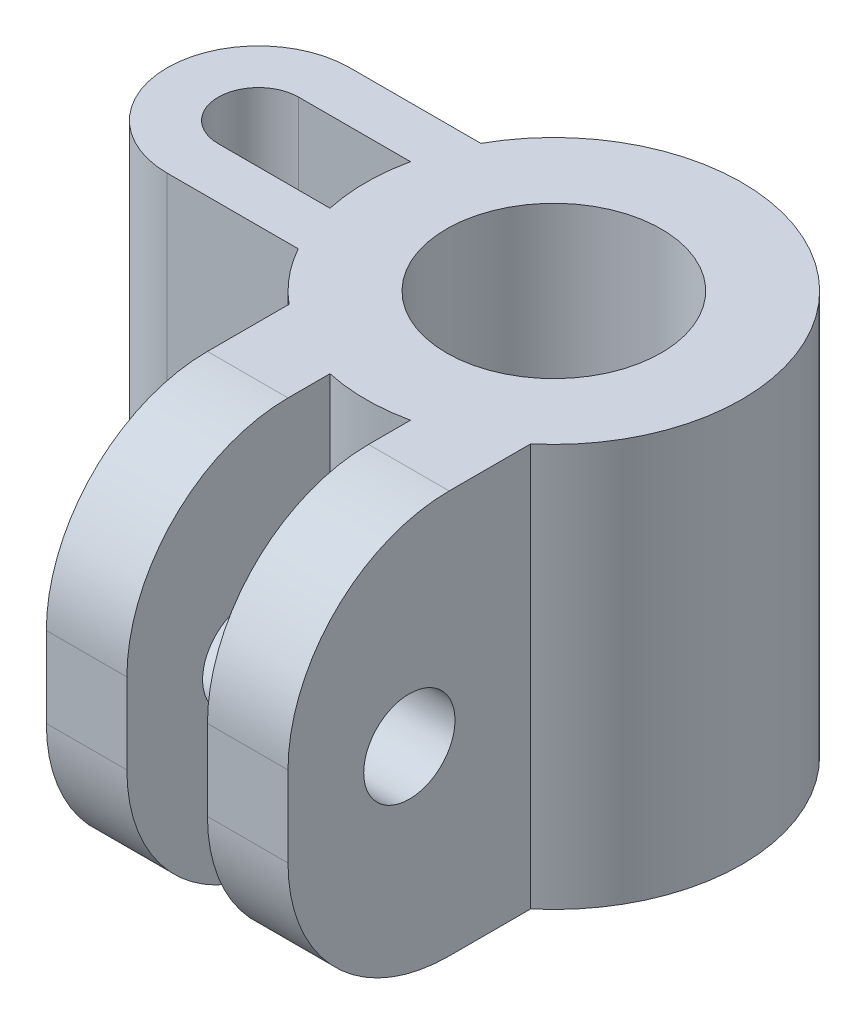
ISO-10303-21;
HEADER;
FILE_DESCRIPTION(('STEP AP214'),'2;1');
FILE_NAME('part.step','',(''),(''),'','','');
FILE_SCHEMA(('AUTOMOTIVE_DESIGN { 1 0 10303 214 1 1 1 1 }'));
ENDSEC;
DATA;
#1=APPLICATION_CONTEXT('core data for automotive mechanical design processes');
#2=APPLICATION_PROTOCOL_DEFINITION('international standard','automotive_design',2000,#1);
#3=PRODUCT_CONTEXT('',#1,'mechanical');
#4=PRODUCT('Part','Part','',(#3));
#5=PRODUCT_RELATED_PRODUCT_CATEGORY('part','',(#4));
#6=PRODUCT_DEFINITION_FORMATION('','',#4);
#7=PRODUCT_DEFINITION_CONTEXT('part definition',#1,'design');
#8=PRODUCT_DEFINITION('design','',#6,#7);
#9=PRODUCT_DEFINITION_SHAPE('','',#8);
#10=(LENGTH_UNIT() NAMED_UNIT(*) SI_UNIT(.MILLI.,.METRE.));
#11=(NAMED_UNIT(*) PLANE_ANGLE_UNIT() SI_UNIT($,.RADIAN.));
#12=(NAMED_UNIT(*) SI_UNIT($,.STERADIAN.) SOLID_ANGLE_UNIT());
#13=UNCERTAINTY_MEASURE_WITH_UNIT(LENGTH_MEASURE(1.E-05),#10,'distance_accuracy_value','');
#14=(GEOMETRIC_REPRESENTATION_CONTEXT(3) GLOBAL_UNCERTAINTY_ASSIGNED_CONTEXT((#13)) GLOBAL_UNIT_ASSIGNED_CONTEXT((#10,
#11,#12)) REPRESENTATION_CONTEXT('',''));
#15=CARTESIAN_POINT('',(0.,0.,0.));
#16=DIRECTION('',(0.,0.,1.));
#17=DIRECTION('',(1.,0.,0.));
#18=AXIS2_PLACEMENT_3D('',#15,#16,#17);
#19=CARTESIAN_POINT('',(0.,75.,0.));
#20=DIRECTION('',(0.,-1.,0.));
#21=DIRECTION('',(0.,0.,-1.));
#22=AXIS2_PLACEMENT_3D('',#19,#20,#21);
#23=CYLINDRICAL_SURFACE('',#22,35.);
#24=CARTESIAN_POINT('',(0.,0.,0.));
#25=DIRECTION('',(0.,1.,0.));
#26=DIRECTION('',(0.,0.,1.));
#27=AXIS2_PLACEMENT_3D('',#24,#25,#26);
#28=CIRCLE('',#27,35.);
#29=CARTESIAN_POINT('',(-7.5,0.,34.1869858279434));
#30=VERTEX_POINT('',#29);
#31=CARTESIAN_POINT('',(7.5,0.,34.1869858279434));
#32=VERTEX_POINT('',#31);
#33=EDGE_CURVE('E284',#30,#32,#28,.T.);
#34=ORIENTED_EDGE('',*,*,#33,.T.);
#35=DIRECTION('',(0.,-1.,0.));
#36=VECTOR('',#35,1.);
#37=CARTESIAN_POINT('',(7.5,75.,34.1869858279434));
#38=LINE('',#37,#36);
#39=CARTESIAN_POINT('',(7.5,75.,34.1869858279434));
#40=VERTEX_POINT('',#39);
#41=EDGE_CURVE('E221',#40,#32,#38,.T.);
#42=ORIENTED_EDGE('',*,*,#41,.F.);
#43=CARTESIAN_POINT('',(0.,75.,0.));
#44=DIRECTION('',(0.,1.,0.));
#45=DIRECTION('',(0.,0.,1.));
#46=AXIS2_PLACEMENT_3D('',#43,#44,#45);
#47=CIRCLE('',#46,35.);
#48=CARTESIAN_POINT('',(-7.5,75.,34.1869858279434));
#49=VERTEX_POINT('',#48);
#50=EDGE_CURVE('E192',#49,#40,#47,.T.);
#51=ORIENTED_EDGE('',*,*,#50,.F.);
#52=DIRECTION('',(0.,-1.,0.));
#53=VECTOR('',#52,1.);
#54=CARTESIAN_POINT('',(-7.5,75.,34.1869858279434));
#55=LINE('',#54,#53);
#56=EDGE_CURVE('E205',#49,#30,#55,.T.);
#57=ORIENTED_EDGE('',*,*,#56,.T.);
#58=EDGE_LOOP('',(#34,#42,#51,#57));
#59=FACE_BOUND('',#58,.T.);
#60=ADVANCED_FACE('F39',(#59),#23,.T.);
#61=CARTESIAN_POINT('',(7.5,75.,0.));
#62=DIRECTION('',(1.,0.,0.));
#63=DIRECTION('',(0.,0.,-1.));
#64=AXIS2_PLACEMENT_3D('',#61,#62,#63);
#65=PLANE('',#64);
#66=CARTESIAN_POINT('',(7.50000000000001,37.5,49.405));
#67=DIRECTION('',(1.,0.,0.));
#68=DIRECTION('',(0.,0.,-1.));
#69=AXIS2_PLACEMENT_3D('',#66,#67,#68);
#70=CIRCLE('',#69,8.5);
#71=CARTESIAN_POINT('',(7.50000000000001,37.5,40.905));
#72=VERTEX_POINT('',#71);
#73=EDGE_CURVE('E280',#72,#72,#70,.T.);
#74=ORIENTED_EDGE('',*,*,#73,.T.);
#75=EDGE_LOOP('',(#74));
#76=FACE_BOUND('',#75,.T.);
#77=DIRECTION('',(0.,0.,1.));
#78=VECTOR('',#77,1.);
#79=CARTESIAN_POINT('',(7.5,0.,0.));
#80=LINE('',#79,#78);
#81=CARTESIAN_POINT('',(7.50000000000001,0.,42.));
#82=VERTEX_POINT('',#81);
#83=EDGE_CURVE('E293',#32,#82,#80,.T.);
#84=ORIENTED_EDGE('',*,*,#83,.T.);
#85=CARTESIAN_POINT('',(7.50000000000001,30.,42.));
#86=DIRECTION('',(1.,0.,0.));
#87=DIRECTION('',(0.,0.,-1.));
#88=AXIS2_PLACEMENT_3D('',#85,#86,#87);
#89=CIRCLE('',#88,30.);
#90=CARTESIAN_POINT('',(7.50000000000001,30.,72.));
#91=VERTEX_POINT('',#90);
#92=EDGE_CURVE('E246',#82,#91,#89,.F.);
#93=ORIENTED_EDGE('',*,*,#92,.T.);
#94=DIRECTION('',(0.,-1.,0.));
#95=VECTOR('',#94,1.);
#96=CARTESIAN_POINT('',(7.50000000000001,75.,72.));
#97=LINE('',#96,#95);
#98=CARTESIAN_POINT('',(7.50000000000001,45.,72.));
#99=VERTEX_POINT('',#98);
#100=EDGE_CURVE('E332',#99,#91,#97,.T.);
#101=ORIENTED_EDGE('',*,*,#100,.F.);
#102=CARTESIAN_POINT('',(7.50000000000001,45.,42.));
#103=DIRECTION('',(1.,0.,0.));
#104=DIRECTION('',(0.,0.,-1.));
#105=AXIS2_PLACEMENT_3D('',#102,#103,#104);
#106=CIRCLE('',#105,30.);
#107=CARTESIAN_POINT('',(7.50000000000001,75.,42.));
#108=VERTEX_POINT('',#107);
#109=EDGE_CURVE('E54',#99,#108,#106,.F.);
#110=ORIENTED_EDGE('',*,*,#109,.T.);
#111=DIRECTION('',(0.,0.,1.));
#112=VECTOR('',#111,1.);
#113=CARTESIAN_POINT('',(7.5,75.,0.));
#114=LINE('',#113,#112);
#115=EDGE_CURVE('E253',#40,#108,#114,.T.);
#116=ORIENTED_EDGE('',*,*,#115,.F.);
#117=ORIENTED_EDGE('',*,*,#41,.T.);
#118=EDGE_LOOP('',(#84,#93,#101,#110,#116,#117));
#119=FACE_BOUND('',#118,.T.);
#120=ADVANCED_FACE('F413',(#76,#119),#65,.F.);
#121=CARTESIAN_POINT('',(1.33226762955019E-13,75.,72.));
#122=DIRECTION('',(0.,0.,-1.));
#123=DIRECTION('',(-1.,0.,0.));
#124=AXIS2_PLACEMENT_3D('',#121,#122,#123);
#125=PLANE('',#124);
#126=ORIENTED_EDGE('',*,*,#100,.T.);
#127=DIRECTION('',(1.,0.,0.));
#128=VECTOR('',#127,1.);
#129=CARTESIAN_POINT('',(1.33226762955019E-13,30.,72.));
#130=LINE('',#129,#128);
#131=CARTESIAN_POINT('',(22.5,30.,72.));
#132=VERTEX_POINT('',#131);
#133=EDGE_CURVE('E239',#91,#132,#130,.T.);
#134=ORIENTED_EDGE('',*,*,#133,.T.);
#135=DIRECTION('',(0.,-1.,0.));
#136=VECTOR('',#135,1.);
#137=CARTESIAN_POINT('',(22.5,75.,72.));
#138=LINE('',#137,#136);
#139=CARTESIAN_POINT('',(22.5,45.,72.));
#140=VERTEX_POINT('',#139);
#141=EDGE_CURVE('E330',#140,#132,#138,.T.);
#142=ORIENTED_EDGE('',*,*,#141,.F.);
#143=DIRECTION('',(1.,0.,0.));
#144=VECTOR('',#143,1.);
#145=CARTESIAN_POINT('',(7.50000000000001,45.,72.));
#146=LINE('',#145,#144);
#147=EDGE_CURVE('E237',#140,#99,#146,.F.);
#148=ORIENTED_EDGE('',*,*,#147,.T.);
#149=EDGE_LOOP('',(#126,#134,#142,#148));
#150=FACE_BOUND('',#149,.T.);
#151=ADVANCED_FACE('F419',(#150),#125,.F.);
#152=CARTESIAN_POINT('',(22.5,75.,0.));
#153=DIRECTION('',(-1.,0.,0.));
#154=DIRECTION('',(0.,0.,1.));
#155=AXIS2_PLACEMENT_3D('',#152,#153,#154);
#156=PLANE('',#155);
#157=CARTESIAN_POINT('',(22.5,37.5,49.405));
#158=DIRECTION('',(-1.,0.,0.));
#159=DIRECTION('',(0.,0.,1.));
#160=AXIS2_PLACEMENT_3D('',#157,#158,#159);
#161=CIRCLE('',#160,8.5);
#162=CARTESIAN_POINT('',(22.5,37.5,57.905));
#163=VERTEX_POINT('',#162);
#164=EDGE_CURVE('E216',#163,#163,#161,.T.);
#165=ORIENTED_EDGE('',*,*,#164,.T.);
#166=EDGE_LOOP('',(#165));
#167=FACE_BOUND('',#166,.T.);
#168=ORIENTED_EDGE('',*,*,#141,.T.);
#169=CARTESIAN_POINT('',(22.5,30.,42.));
#170=DIRECTION('',(-1.,0.,0.));
#171=DIRECTION('',(0.,0.,1.));
#172=AXIS2_PLACEMENT_3D('',#169,#170,#171);
#173=CIRCLE('',#172,30.);
#174=CARTESIAN_POINT('',(22.5,0.,42.));
#175=VERTEX_POINT('',#174);
#176=EDGE_CURVE('E243',#132,#175,#173,.F.);
#177=ORIENTED_EDGE('',*,*,#176,.T.);
#178=DIRECTION('',(0.,0.,-1.));
#179=VECTOR('',#178,1.);
#180=CARTESIAN_POINT('',(22.5,0.,0.));
#181=LINE('',#180,#179);
#182=CARTESIAN_POINT('',(22.5,0.,26.809513236909));
#183=VERTEX_POINT('',#182);
#184=EDGE_CURVE('E296',#175,#183,#181,.T.);
#185=ORIENTED_EDGE('',*,*,#184,.T.);
#186=DIRECTION('',(0.,-1.,0.));
#187=VECTOR('',#186,1.);
#188=CARTESIAN_POINT('',(22.5,75.,26.809513236909));
#189=LINE('',#188,#187);
#190=CARTESIAN_POINT('',(22.5,75.,26.809513236909));
#191=VERTEX_POINT('',#190);
#192=EDGE_CURVE('E259',#191,#183,#189,.T.);
#193=ORIENTED_EDGE('',*,*,#192,.F.);
#194=DIRECTION('',(0.,0.,-1.));
#195=VECTOR('',#194,1.);
#196=CARTESIAN_POINT('',(22.5,75.,0.));
#197=LINE('',#196,#195);
#198=CARTESIAN_POINT('',(22.5,75.,42.));
#199=VERTEX_POINT('',#198);
#200=EDGE_CURVE('E250',#199,#191,#197,.T.);
#201=ORIENTED_EDGE('',*,*,#200,.F.);
#202=CARTESIAN_POINT('',(22.5,45.,42.));
#203=DIRECTION('',(-1.,0.,0.));
#204=DIRECTION('',(0.,0.,1.));
#205=AXIS2_PLACEMENT_3D('',#202,#203,#204);
#206=CIRCLE('',#205,30.);
#207=EDGE_CURVE('E62',#199,#140,#206,.F.);
#208=ORIENTED_EDGE('',*,*,#207,.T.);
#209=EDGE_LOOP('',(#168,#177,#185,#193,#201,#208));
#210=FACE_BOUND('',#209,.T.);
#211=ADVANCED_FACE('F256',(#167,#210),#156,.F.);
#212=CARTESIAN_POINT('',(-30.5941170815567,0.,-17.));
#213=VERTEX_POINT('',#212);
#214=EDGE_CURVE('E298',#183,#213,#28,.T.);
#215=ORIENTED_EDGE('',*,*,#214,.T.);
#216=DIRECTION('',(0.,-1.,0.));
#217=VECTOR('',#216,1.);
#218=CARTESIAN_POINT('',(-30.5941170815567,75.,-17.));
#219=LINE('',#218,#217);
#220=CARTESIAN_POINT('',(-30.5941170815567,75.,-17.));
#221=VERTEX_POINT('',#220);
#222=EDGE_CURVE('E326',#221,#213,#219,.T.);
#223=ORIENTED_EDGE('',*,*,#222,.F.);
#224=EDGE_CURVE('E261',#191,#221,#47,.T.);
#225=ORIENTED_EDGE('',*,*,#224,.F.);
#226=ORIENTED_EDGE('',*,*,#192,.T.);
#227=EDGE_LOOP('',(#215,#223,#225,#226));
#228=FACE_BOUND('',#227,.T.);
#229=ADVANCED_FACE('F415',(#228),#23,.T.);
#230=CARTESIAN_POINT('',(0.,75.,-17.));
#231=DIRECTION('',(0.,0.,1.));
#232=DIRECTION('',(1.,0.,0.));
#233=AXIS2_PLACEMENT_3D('',#230,#231,#232);
#234=PLANE('',#233);
#235=DIRECTION('',(-1.,0.,0.));
#236=VECTOR('',#235,1.);
#237=CARTESIAN_POINT('',(0.,0.,-17.));
#238=LINE('',#237,#236);
#239=CARTESIAN_POINT('',(-55.,0.,-17.));
#240=VERTEX_POINT('',#239);
#241=EDGE_CURVE('E299',#213,#240,#238,.T.);
#242=ORIENTED_EDGE('',*,*,#241,.T.);
#243=DIRECTION('',(0.,-1.,0.));
#244=VECTOR('',#243,1.);
#245=CARTESIAN_POINT('',(-55.,75.,-17.));
#246=LINE('',#245,#244);
#247=CARTESIAN_POINT('',(-55.,75.,-17.));
#248=VERTEX_POINT('',#247);
#249=EDGE_CURVE('E323',#248,#240,#246,.T.);
#250=ORIENTED_EDGE('',*,*,#249,.F.);
#251=DIRECTION('',(-1.,0.,0.));
#252=VECTOR('',#251,1.);
#253=CARTESIAN_POINT('',(0.,75.,-17.));
#254=LINE('',#253,#252);
#255=EDGE_CURVE('E263',#221,#248,#254,.T.);
#256=ORIENTED_EDGE('',*,*,#255,.F.);
#257=ORIENTED_EDGE('',*,*,#222,.T.);
#258=EDGE_LOOP('',(#242,#250,#256,#257));
#259=FACE_BOUND('',#258,.T.);
#260=ADVANCED_FACE('F425',(#259),#234,.F.);
#261=CARTESIAN_POINT('',(-55.,75.,0.));
#262=DIRECTION('',(0.,-1.,0.));
#263=DIRECTION('',(0.,0.,-1.));
#264=AXIS2_PLACEMENT_3D('',#261,#262,#263);
#265=CYLINDRICAL_SURFACE('',#264,17.);
#266=CARTESIAN_POINT('',(-55.,0.,0.));
#267=DIRECTION('',(0.,1.,0.));
#268=DIRECTION('',(0.,0.,1.));
#269=AXIS2_PLACEMENT_3D('',#266,#267,#268);
#270=CIRCLE('',#269,17.);
#271=CARTESIAN_POINT('',(-55.,0.,17.));
#272=VERTEX_POINT('',#271);
#273=EDGE_CURVE('E301',#240,#272,#270,.T.);
#274=ORIENTED_EDGE('',*,*,#273,.T.);
#275=DIRECTION('',(0.,-1.,0.));
#276=VECTOR('',#275,1.);
#277=CARTESIAN_POINT('',(-55.,75.,17.));
#278=LINE('',#277,#276);
#279=CARTESIAN_POINT('',(-55.,75.,17.));
#280=VERTEX_POINT('',#279);
#281=EDGE_CURVE('E320',#280,#272,#278,.T.);
#282=ORIENTED_EDGE('',*,*,#281,.F.);
#283=CARTESIAN_POINT('',(-55.,75.,0.));
#284=DIRECTION('',(0.,1.,0.));
#285=DIRECTION('',(0.,0.,1.));
#286=AXIS2_PLACEMENT_3D('',#283,#284,#285);
#287=CIRCLE('',#286,17.);
#288=EDGE_CURVE('E268',#248,#280,#287,.T.);
#289=ORIENTED_EDGE('',*,*,#288,.F.);
#290=ORIENTED_EDGE('',*,*,#249,.T.);
#291=EDGE_LOOP('',(#274,#282,#289,#290));
#292=FACE_BOUND('',#291,.T.);
#293=ADVANCED_FACE('F440',(#292),#265,.T.);
#294=CARTESIAN_POINT('',(0.,75.,17.));
#295=DIRECTION('',(0.,0.,-1.));
#296=DIRECTION('',(-1.,0.,0.));
#297=AXIS2_PLACEMENT_3D('',#294,#295,#296);
#298=PLANE('',#297);
#299=DIRECTION('',(1.,0.,0.));
#300=VECTOR('',#299,1.);
#301=CARTESIAN_POINT('',(0.,0.,17.));
#302=LINE('',#301,#300);
#303=CARTESIAN_POINT('',(-30.5941170815567,0.,17.));
#304=VERTEX_POINT('',#303);
#305=EDGE_CURVE('E303',#272,#304,#302,.T.);
#306=ORIENTED_EDGE('',*,*,#305,.T.);
#307=DIRECTION('',(0.,-1.,0.));
#308=VECTOR('',#307,1.);
#309=CARTESIAN_POINT('',(-30.5941170815567,75.,17.));
#310=LINE('',#309,#308);
#311=CARTESIAN_POINT('',(-30.5941170815567,75.,17.));
#312=VERTEX_POINT('',#311);
#313=EDGE_CURVE('E317',#312,#304,#310,.T.);
#314=ORIENTED_EDGE('',*,*,#313,.F.);
#315=DIRECTION('',(1.,0.,0.));
#316=VECTOR('',#315,1.);
#317=CARTESIAN_POINT('',(0.,75.,17.));
#318=LINE('',#317,#316);
#319=EDGE_CURVE('E270',#280,#312,#318,.T.);
#320=ORIENTED_EDGE('',*,*,#319,.F.);
#321=ORIENTED_EDGE('',*,*,#281,.T.);
#322=EDGE_LOOP('',(#306,#314,#320,#321));
#323=FACE_BOUND('',#322,.T.);
#324=ADVANCED_FACE('F435',(#323),#298,.F.);
#325=CARTESIAN_POINT('',(-22.5,0.,26.809513236909));
#326=VERTEX_POINT('',#325);
#327=EDGE_CURVE('E283',#304,#326,#28,.T.);
#328=ORIENTED_EDGE('',*,*,#327,.T.);
#329=DIRECTION('',(0.,-1.,0.));
#330=VECTOR('',#329,1.);
#331=CARTESIAN_POINT('',(-22.5,75.,26.809513236909));
#332=LINE('',#331,#330);
#333=CARTESIAN_POINT('',(-22.5,75.,26.809513236909));
#334=VERTEX_POINT('',#333);
#335=EDGE_CURVE('E314',#334,#326,#332,.T.);
#336=ORIENTED_EDGE('',*,*,#335,.F.);
#337=EDGE_CURVE('E191',#312,#334,#47,.T.);
#338=ORIENTED_EDGE('',*,*,#337,.F.);
#339=ORIENTED_EDGE('',*,*,#313,.T.);
#340=EDGE_LOOP('',(#328,#336,#338,#339));
#341=FACE_BOUND('',#340,.T.);
#342=ADVANCED_FACE('F380',(#341),#23,.T.);
#343=CARTESIAN_POINT('',(-22.5,75.,0.));
#344=DIRECTION('',(-1.,0.,0.));
#345=DIRECTION('',(0.,0.,1.));
#346=AXIS2_PLACEMENT_3D('',#343,#344,#345);
#347=PLANE('',#346);
#348=CARTESIAN_POINT('',(-22.5,37.5,49.405));
#349=DIRECTION('',(-1.,0.,0.));
#350=DIRECTION('',(0.,0.,1.));
#351=AXIS2_PLACEMENT_3D('',#348,#349,#350);
#352=CIRCLE('',#351,8.5);
#353=CARTESIAN_POINT('',(-22.5,37.5,57.905));
#354=VERTEX_POINT('',#353);
#355=EDGE_CURVE('E217',#354,#354,#352,.F.);
#356=ORIENTED_EDGE('',*,*,#355,.T.);
#357=EDGE_LOOP('',(#356));
#358=FACE_BOUND('',#357,.T.);
#359=DIRECTION('',(0.,0.,-1.));
#360=VECTOR('',#359,1.);
#361=CARTESIAN_POINT('',(-22.5,0.,0.));
#362=LINE('',#361,#360);
#363=CARTESIAN_POINT('',(-22.5,0.,42.));
#364=VERTEX_POINT('',#363);
#365=EDGE_CURVE('E305',#364,#326,#362,.T.);
#366=ORIENTED_EDGE('',*,*,#365,.F.);
#367=CARTESIAN_POINT('',(-22.5,30.,42.));
#368=DIRECTION('',(-1.,0.,0.));
#369=DIRECTION('',(0.,0.,1.));
#370=AXIS2_PLACEMENT_3D('',#367,#368,#369);
#371=CIRCLE('',#370,30.);
#372=CARTESIAN_POINT('',(-22.5,30.,72.));
#373=VERTEX_POINT('',#372);
#374=EDGE_CURVE('E226',#364,#373,#371,.T.);
#375=ORIENTED_EDGE('',*,*,#374,.T.);
#376=DIRECTION('',(0.,-1.,0.));
#377=VECTOR('',#376,1.);
#378=CARTESIAN_POINT('',(-22.5,75.,72.));
#379=LINE('',#378,#377);
#380=CARTESIAN_POINT('',(-22.5,45.,72.));
#381=VERTEX_POINT('',#380);
#382=EDGE_CURVE('E311',#381,#373,#379,.T.);
#383=ORIENTED_EDGE('',*,*,#382,.F.);
#384=CARTESIAN_POINT('',(-22.5,45.,42.));
#385=DIRECTION('',(-1.,0.,0.));
#386=DIRECTION('',(0.,0.,1.));
#387=AXIS2_PLACEMENT_3D('',#384,#385,#386);
#388=CIRCLE('',#387,30.);
#389=CARTESIAN_POINT('',(-22.5,75.,42.));
#390=VERTEX_POINT('',#389);
#391=EDGE_CURVE('E224',#381,#390,#388,.T.);
#392=ORIENTED_EDGE('',*,*,#391,.T.);
#393=DIRECTION('',(0.,0.,-1.));
#394=VECTOR('',#393,1.);
#395=CARTESIAN_POINT('',(-22.5,75.,0.));
#396=LINE('',#395,#394);
#397=EDGE_CURVE('E272',#390,#334,#396,.T.);
#398=ORIENTED_EDGE('',*,*,#397,.T.);
#399=ORIENTED_EDGE('',*,*,#335,.T.);
#400=EDGE_LOOP('',(#366,#375,#383,#392,#398,#399));
#401=FACE_BOUND('',#400,.T.);
#402=ADVANCED_FACE('F363',(#358,#401),#347,.T.);
#403=CARTESIAN_POINT('',(-1.33226762955019E-13,75.,72.));
#404=DIRECTION('',(0.,0.,1.));
#405=DIRECTION('',(1.,0.,0.));
#406=AXIS2_PLACEMENT_3D('',#403,#404,#405);
#407=PLANE('',#406);
#408=ORIENTED_EDGE('',*,*,#382,.T.);
#409=DIRECTION('',(-1.,0.,0.));
#410=VECTOR('',#409,1.);
#411=CARTESIAN_POINT('',(-7.49999999999999,30.,72.));
#412=LINE('',#411,#410);
#413=CARTESIAN_POINT('',(-7.49999999999999,30.,72.));
#414=VERTEX_POINT('',#413);
#415=EDGE_CURVE('E231',#373,#414,#412,.F.);
#416=ORIENTED_EDGE('',*,*,#415,.T.);
#417=DIRECTION('',(0.,-1.,0.));
#418=VECTOR('',#417,1.);
#419=CARTESIAN_POINT('',(-7.49999999999999,75.,72.));
#420=LINE('',#419,#418);
#421=CARTESIAN_POINT('',(-7.49999999999999,45.,72.));
#422=VERTEX_POINT('',#421);
#423=EDGE_CURVE('E207',#422,#414,#420,.T.);
#424=ORIENTED_EDGE('',*,*,#423,.F.);
#425=DIRECTION('',(-1.,0.,0.));
#426=VECTOR('',#425,1.);
#427=CARTESIAN_POINT('',(-1.33226762955019E-13,45.,72.));
#428=LINE('',#427,#426);
#429=EDGE_CURVE('E228',#422,#381,#428,.T.);
#430=ORIENTED_EDGE('',*,*,#429,.T.);
#431=EDGE_LOOP('',(#408,#416,#424,#430));
#432=FACE_BOUND('',#431,.T.);
#433=ADVANCED_FACE('F365',(#432),#407,.T.);
#434=CARTESIAN_POINT('',(0.,75.,-7.5));
#435=DIRECTION('',(0.,0.,-1.));
#436=DIRECTION('',(-1.,0.,0.));
#437=AXIS2_PLACEMENT_3D('',#434,#435,#436);
#438=PLANE('',#437);
#439=DIRECTION('',(1.,0.,0.));
#440=VECTOR('',#439,1.);
#441=CARTESIAN_POINT('',(0.,0.,-7.5));
#442=LINE('',#441,#440);
#443=CARTESIAN_POINT('',(-55.,0.,-7.5));
#444=VERTEX_POINT('',#443);
#445=CARTESIAN_POINT('',(-34.1869858279434,0.,-7.5));
#446=VERTEX_POINT('',#445);
#447=EDGE_CURVE('E204',#444,#446,#442,.T.);
#448=ORIENTED_EDGE('',*,*,#447,.T.);
#449=DIRECTION('',(0.,-1.,0.));
#450=VECTOR('',#449,1.);
#451=CARTESIAN_POINT('',(-34.1869858279434,75.,-7.5));
#452=LINE('',#451,#450);
#453=CARTESIAN_POINT('',(-34.1869858279434,75.,-7.5));
#454=VERTEX_POINT('',#453);
#455=EDGE_CURVE('E182',#454,#446,#452,.T.);
#456=ORIENTED_EDGE('',*,*,#455,.F.);
#457=DIRECTION('',(1.,0.,0.));
#458=VECTOR('',#457,1.);
#459=CARTESIAN_POINT('',(0.,75.,-7.5));
#460=LINE('',#459,#458);
#461=CARTESIAN_POINT('',(-55.,75.,-7.5));
#462=VERTEX_POINT('',#461);
#463=EDGE_CURVE('E189',#462,#454,#460,.T.);
#464=ORIENTED_EDGE('',*,*,#463,.F.);
#465=DIRECTION('',(0.,-1.,0.));
#466=VECTOR('',#465,1.);
#467=CARTESIAN_POINT('',(-55.,75.,-7.5));
#468=LINE('',#467,#466);
#469=EDGE_CURVE('E277',#462,#444,#468,.T.);
#470=ORIENTED_EDGE('',*,*,#469,.T.);
#471=EDGE_LOOP('',(#448,#456,#464,#470));
#472=FACE_BOUND('',#471,.T.);
#473=ADVANCED_FACE('F202',(#472),#438,.F.);
#474=CARTESIAN_POINT('',(-34.1869858279434,0.,7.5));
#475=VERTEX_POINT('',#474);
#476=EDGE_CURVE('E279',#446,#475,#28,.T.);
#477=ORIENTED_EDGE('',*,*,#476,.T.);
#478=DIRECTION('',(0.,-1.,0.));
#479=VECTOR('',#478,1.);
#480=CARTESIAN_POINT('',(-34.1869858279434,75.,7.5));
#481=LINE('',#480,#479);
#482=CARTESIAN_POINT('',(-34.1869858279434,75.,7.5));
#483=VERTEX_POINT('',#482);
#484=EDGE_CURVE('E184',#483,#475,#481,.T.);
#485=ORIENTED_EDGE('',*,*,#484,.F.);
#486=EDGE_CURVE('E177',#454,#483,#47,.T.);
#487=ORIENTED_EDGE('',*,*,#486,.F.);
#488=ORIENTED_EDGE('',*,*,#455,.T.);
#489=EDGE_LOOP('',(#477,#485,#487,#488));
#490=FACE_BOUND('',#489,.T.);
#491=ADVANCED_FACE('F180',(#490),#23,.T.);
#492=CARTESIAN_POINT('',(0.,75.,7.5));
#493=DIRECTION('',(0.,0.,-1.));
#494=DIRECTION('',(-1.,0.,0.));
#495=AXIS2_PLACEMENT_3D('',#492,#493,#494);
#496=PLANE('',#495);
#497=DIRECTION('',(1.,0.,0.));
#498=VECTOR('',#497,1.);
#499=CARTESIAN_POINT('',(0.,0.,7.5));
#500=LINE('',#499,#498);
#501=CARTESIAN_POINT('',(-55.,0.,7.5));
#502=VERTEX_POINT('',#501);
#503=EDGE_CURVE('E282',#502,#475,#500,.T.);
#504=ORIENTED_EDGE('',*,*,#503,.F.);
#505=DIRECTION('',(0.,-1.,0.));
#506=VECTOR('',#505,1.);
#507=CARTESIAN_POINT('',(-55.,75.,7.5));
#508=LINE('',#507,#506);
#509=CARTESIAN_POINT('',(-55.,75.,7.5));
#510=VERTEX_POINT('',#509);
#511=EDGE_CURVE('E209',#510,#502,#508,.T.);
#512=ORIENTED_EDGE('',*,*,#511,.F.);
#513=DIRECTION('',(1.,0.,0.));
#514=VECTOR('',#513,1.);
#515=CARTESIAN_POINT('',(0.,75.,7.5));
#516=LINE('',#515,#514);
#517=EDGE_CURVE('E188',#510,#483,#516,.T.);
#518=ORIENTED_EDGE('',*,*,#517,.T.);
#519=ORIENTED_EDGE('',*,*,#484,.T.);
#520=EDGE_LOOP('',(#504,#512,#518,#519));
#521=FACE_BOUND('',#520,.T.);
#522=ADVANCED_FACE('F342',(#521),#496,.T.);
#523=CARTESIAN_POINT('',(0.,75.,0.));
#524=DIRECTION('',(0.,-1.,0.));
#525=DIRECTION('',(0.,0.,-1.));
#526=AXIS2_PLACEMENT_3D('',#523,#524,#525);
#527=CYLINDRICAL_SURFACE('',#526,20.);
#528=CARTESIAN_POINT('',(0.,75.,0.));
#529=DIRECTION('',(0.,1.,0.));
#530=DIRECTION('',(0.,0.,1.));
#531=AXIS2_PLACEMENT_3D('',#528,#529,#530);
#532=CIRCLE('',#531,20.);
#533=CARTESIAN_POINT('',(0.,75.,20.));
#534=VERTEX_POINT('',#533);
#535=EDGE_CURVE('E390',#534,#534,#532,.T.);
#536=ORIENTED_EDGE('',*,*,#535,.T.);
#537=EDGE_LOOP('',(#536));
#538=FACE_BOUND('',#537,.T.);
#539=CARTESIAN_POINT('',(0.,0.,0.));
#540=DIRECTION('',(0.,1.,0.));
#541=DIRECTION('',(0.,0.,1.));
#542=AXIS2_PLACEMENT_3D('',#539,#540,#541);
#543=CIRCLE('',#542,20.);
#544=CARTESIAN_POINT('',(0.,0.,20.));
#545=VERTEX_POINT('',#544);
#546=EDGE_CURVE('E290',#545,#545,#543,.T.);
#547=ORIENTED_EDGE('',*,*,#546,.F.);
#548=EDGE_LOOP('',(#547));
#549=FACE_BOUND('',#548,.T.);
#550=ADVANCED_FACE('F431',(#538,#549),#527,.F.);
#551=CARTESIAN_POINT('',(-55.,75.,0.));
#552=DIRECTION('',(0.,-1.,0.));
#553=DIRECTION('',(0.,0.,-1.));
#554=AXIS2_PLACEMENT_3D('',#551,#552,#553);
#555=CYLINDRICAL_SURFACE('',#554,7.5);
#556=CARTESIAN_POINT('',(-55.,0.,0.));
#557=DIRECTION('',(0.,1.,0.));
#558=DIRECTION('',(0.,0.,1.));
#559=AXIS2_PLACEMENT_3D('',#556,#557,#558);
#560=CIRCLE('',#559,7.5);
#561=EDGE_CURVE('E287',#444,#502,#560,.T.);
#562=ORIENTED_EDGE('',*,*,#561,.F.);
#563=ORIENTED_EDGE('',*,*,#469,.F.);
#564=CARTESIAN_POINT('',(-55.,75.,0.));
#565=DIRECTION('',(0.,1.,0.));
#566=DIRECTION('',(0.,0.,1.));
#567=AXIS2_PLACEMENT_3D('',#564,#565,#566);
#568=CIRCLE('',#567,7.5);
#569=EDGE_CURVE('E198',#462,#510,#568,.T.);
#570=ORIENTED_EDGE('',*,*,#569,.T.);
#571=ORIENTED_EDGE('',*,*,#511,.T.);
#572=EDGE_LOOP('',(#562,#563,#570,#571));
#573=FACE_BOUND('',#572,.T.);
#574=ADVANCED_FACE('F340',(#573),#555,.F.);
#575=CARTESIAN_POINT('',(-7.5,75.,0.));
#576=DIRECTION('',(1.,0.,0.));
#577=DIRECTION('',(0.,0.,-1.));
#578=AXIS2_PLACEMENT_3D('',#575,#576,#577);
#579=PLANE('',#578);
#580=CARTESIAN_POINT('',(-7.49999999999999,37.5,49.405));
#581=DIRECTION('',(1.,0.,0.));
#582=DIRECTION('',(0.,0.,-1.));
#583=AXIS2_PLACEMENT_3D('',#580,#581,#582);
#584=CIRCLE('',#583,8.5);
#585=CARTESIAN_POINT('',(-7.49999999999999,37.5,40.905));
#586=VERTEX_POINT('',#585);
#587=EDGE_CURVE('E213',#586,#586,#584,.T.);
#588=ORIENTED_EDGE('',*,*,#587,.F.);
#589=EDGE_LOOP('',(#588));
#590=FACE_BOUND('',#589,.T.);
#591=ORIENTED_EDGE('',*,*,#423,.T.);
#592=CARTESIAN_POINT('',(-7.49999999999999,30.,42.));
#593=DIRECTION('',(1.,0.,0.));
#594=DIRECTION('',(0.,0.,-1.));
#595=AXIS2_PLACEMENT_3D('',#592,#593,#594);
#596=CIRCLE('',#595,30.);
#597=CARTESIAN_POINT('',(-7.49999999999999,0.,42.));
#598=VERTEX_POINT('',#597);
#599=EDGE_CURVE('E235',#414,#598,#596,.T.);
#600=ORIENTED_EDGE('',*,*,#599,.T.);
#601=DIRECTION('',(0.,0.,1.));
#602=VECTOR('',#601,1.);
#603=CARTESIAN_POINT('',(-7.5,0.,0.));
#604=LINE('',#603,#602);
#605=EDGE_CURVE('E200',#30,#598,#604,.T.);
#606=ORIENTED_EDGE('',*,*,#605,.F.);
#607=ORIENTED_EDGE('',*,*,#56,.F.);
#608=DIRECTION('',(0.,0.,1.));
#609=VECTOR('',#608,1.);
#610=CARTESIAN_POINT('',(-7.5,75.,0.));
#611=LINE('',#610,#609);
#612=CARTESIAN_POINT('',(-7.49999999999999,75.,42.));
#613=VERTEX_POINT('',#612);
#614=EDGE_CURVE('E274',#49,#613,#611,.T.);
#615=ORIENTED_EDGE('',*,*,#614,.T.);
#616=CARTESIAN_POINT('',(-7.49999999999999,45.,42.));
#617=DIRECTION('',(1.,0.,0.));
#618=DIRECTION('',(0.,0.,-1.));
#619=AXIS2_PLACEMENT_3D('',#616,#617,#618);
#620=CIRCLE('',#619,30.);
#621=EDGE_CURVE('E233',#613,#422,#620,.T.);
#622=ORIENTED_EDGE('',*,*,#621,.T.);
#623=EDGE_LOOP('',(#591,#600,#606,#607,#615,#622));
#624=FACE_BOUND('',#623,.T.);
#625=ADVANCED_FACE('F389',(#590,#624),#579,.T.);
#626=CARTESIAN_POINT('',(0.,75.,0.));
#627=DIRECTION('',(0.,1.,0.));
#628=DIRECTION('',(0.,0.,1.));
#629=AXIS2_PLACEMENT_3D('',#626,#627,#628);
#630=PLANE('',#629);
#631=ORIENTED_EDGE('',*,*,#463,.T.);
#632=ORIENTED_EDGE('',*,*,#486,.T.);
#633=ORIENTED_EDGE('',*,*,#517,.F.);
#634=ORIENTED_EDGE('',*,*,#569,.F.);
#635=EDGE_LOOP('',(#631,#632,#633,#634));
#636=FACE_BOUND('',#635,.T.);
#637=ORIENTED_EDGE('',*,*,#535,.F.);
#638=EDGE_LOOP('',(#637));
#639=FACE_BOUND('',#638,.T.);
#640=ORIENTED_EDGE('',*,*,#397,.F.);
#641=DIRECTION('',(-1.,0.,0.));
#642=VECTOR('',#641,1.);
#643=CARTESIAN_POINT('',(0.,75.,42.));
#644=LINE('',#643,#642);
#645=EDGE_CURVE('E11',#390,#613,#644,.F.);
#646=ORIENTED_EDGE('',*,*,#645,.T.);
#647=ORIENTED_EDGE('',*,*,#614,.F.);
#648=ORIENTED_EDGE('',*,*,#50,.T.);
#649=ORIENTED_EDGE('',*,*,#115,.T.);
#650=DIRECTION('',(1.,0.,0.));
#651=VECTOR('',#650,1.);
#652=CARTESIAN_POINT('',(22.5,75.,42.));
#653=LINE('',#652,#651);
#654=EDGE_CURVE('E47',#108,#199,#653,.T.);
#655=ORIENTED_EDGE('',*,*,#654,.T.);
#656=ORIENTED_EDGE('',*,*,#200,.T.);
#657=ORIENTED_EDGE('',*,*,#224,.T.);
#658=ORIENTED_EDGE('',*,*,#255,.T.);
#659=ORIENTED_EDGE('',*,*,#288,.T.);
#660=ORIENTED_EDGE('',*,*,#319,.T.);
#661=ORIENTED_EDGE('',*,*,#337,.T.);
#662=EDGE_LOOP('',(#640,#646,#647,#648,#649,#655,#656,#657,#658,#659,#660,#661));
#663=FACE_BOUND('',#662,.T.);
#664=ADVANCED_FACE('F195',(#636,#639,#663),#630,.T.);
#665=CARTESIAN_POINT('',(0.,0.,0.));
#666=DIRECTION('',(0.,1.,0.));
#667=DIRECTION('',(0.,0.,1.));
#668=AXIS2_PLACEMENT_3D('',#665,#666,#667);
#669=PLANE('',#668);
#670=ORIENTED_EDGE('',*,*,#447,.F.);
#671=ORIENTED_EDGE('',*,*,#561,.T.);
#672=ORIENTED_EDGE('',*,*,#503,.T.);
#673=ORIENTED_EDGE('',*,*,#476,.F.);
#674=EDGE_LOOP('',(#670,#671,#672,#673));
#675=FACE_BOUND('',#674,.T.);
#676=ORIENTED_EDGE('',*,*,#546,.T.);
#677=EDGE_LOOP('',(#676));
#678=FACE_BOUND('',#677,.T.);
#679=ORIENTED_EDGE('',*,*,#605,.T.);
#680=DIRECTION('',(-1.,0.,0.));
#681=VECTOR('',#680,1.);
#682=CARTESIAN_POINT('',(-22.4999999999999,0.,42.));
#683=LINE('',#682,#681);
#684=EDGE_CURVE('E220',#598,#364,#683,.T.);
#685=ORIENTED_EDGE('',*,*,#684,.T.);
#686=ORIENTED_EDGE('',*,*,#365,.T.);
#687=ORIENTED_EDGE('',*,*,#327,.F.);
#688=ORIENTED_EDGE('',*,*,#305,.F.);
#689=ORIENTED_EDGE('',*,*,#273,.F.);
#690=ORIENTED_EDGE('',*,*,#241,.F.);
#691=ORIENTED_EDGE('',*,*,#214,.F.);
#692=ORIENTED_EDGE('',*,*,#184,.F.);
#693=DIRECTION('',(1.,0.,0.));
#694=VECTOR('',#693,1.);
#695=CARTESIAN_POINT('',(0.,0.,42.));
#696=LINE('',#695,#694);
#697=EDGE_CURVE('E218',#175,#82,#696,.F.);
#698=ORIENTED_EDGE('',*,*,#697,.T.);
#699=ORIENTED_EDGE('',*,*,#83,.F.);
#700=ORIENTED_EDGE('',*,*,#33,.F.);
#701=EDGE_LOOP('',(#679,#685,#686,#687,#688,#689,#690,#691,#692,#698,#699,#700));
#702=FACE_BOUND('',#701,.T.);
#703=ADVANCED_FACE('F344',(#675,#678,#702),#669,.F.);
#704=CARTESIAN_POINT('',(-46.5416305603426,37.5,49.405));
#705=DIRECTION('',(1.,0.,0.));
#706=DIRECTION('',(0.,0.,-1.));
#707=AXIS2_PLACEMENT_3D('',#704,#705,#706);
#708=CYLINDRICAL_SURFACE('',#707,8.5);
#709=ORIENTED_EDGE('',*,*,#587,.T.);
#710=EDGE_LOOP('',(#709));
#711=FACE_BOUND('',#710,.T.);
#712=ORIENTED_EDGE('',*,*,#355,.F.);
#713=EDGE_LOOP('',(#712));
#714=FACE_BOUND('',#713,.T.);
#715=ADVANCED_FACE('F347',(#711,#714),#708,.F.);
#716=ORIENTED_EDGE('',*,*,#164,.F.);
#717=EDGE_LOOP('',(#716));
#718=FACE_BOUND('',#717,.T.);
#719=ORIENTED_EDGE('',*,*,#73,.F.);
#720=EDGE_LOOP('',(#719));
#721=FACE_BOUND('',#720,.T.);
#722=ADVANCED_FACE('F404',(#718,#721),#708,.F.);
#723=CARTESIAN_POINT('',(0.,30.,42.));
#724=DIRECTION('',(1.,0.,0.));
#725=DIRECTION('',(0.,0.,-1.));
#726=AXIS2_PLACEMENT_3D('',#723,#724,#725);
#727=CYLINDRICAL_SURFACE('',#726,30.);
#728=ORIENTED_EDGE('',*,*,#599,.F.);
#729=ORIENTED_EDGE('',*,*,#415,.F.);
#730=ORIENTED_EDGE('',*,*,#374,.F.);
#731=ORIENTED_EDGE('',*,*,#684,.F.);
#732=EDGE_LOOP('',(#728,#729,#730,#731));
#733=FACE_BOUND('',#732,.T.);
#734=ADVANCED_FACE('F359',(#733),#727,.T.);
#735=CARTESIAN_POINT('',(0.,30.,42.));
#736=DIRECTION('',(1.,0.,0.));
#737=DIRECTION('',(0.,0.,-1.));
#738=AXIS2_PLACEMENT_3D('',#735,#736,#737);
#739=CYLINDRICAL_SURFACE('',#738,30.);
#740=ORIENTED_EDGE('',*,*,#92,.F.);
#741=ORIENTED_EDGE('',*,*,#697,.F.);
#742=ORIENTED_EDGE('',*,*,#176,.F.);
#743=ORIENTED_EDGE('',*,*,#133,.F.);
#744=EDGE_LOOP('',(#740,#741,#742,#743));
#745=FACE_BOUND('',#744,.T.);
#746=ADVANCED_FACE('F464',(#745),#739,.T.);
#747=CARTESIAN_POINT('',(0.,45.,42.));
#748=DIRECTION('',(-1.,0.,0.));
#749=DIRECTION('',(0.,0.,1.));
#750=AXIS2_PLACEMENT_3D('',#747,#748,#749);
#751=CYLINDRICAL_SURFACE('',#750,30.);
#752=ORIENTED_EDGE('',*,*,#621,.F.);
#753=ORIENTED_EDGE('',*,*,#645,.F.);
#754=ORIENTED_EDGE('',*,*,#391,.F.);
#755=ORIENTED_EDGE('',*,*,#429,.F.);
#756=EDGE_LOOP('',(#752,#753,#754,#755));
#757=FACE_BOUND('',#756,.T.);
#758=ADVANCED_FACE('F370',(#757),#751,.T.);
#759=CARTESIAN_POINT('',(0.,45.,42.));
#760=DIRECTION('',(-1.,0.,0.));
#761=DIRECTION('',(0.,0.,1.));
#762=AXIS2_PLACEMENT_3D('',#759,#760,#761);
#763=CYLINDRICAL_SURFACE('',#762,30.);
#764=ORIENTED_EDGE('',*,*,#109,.F.);
#765=ORIENTED_EDGE('',*,*,#147,.F.);
#766=ORIENTED_EDGE('',*,*,#207,.F.);
#767=ORIENTED_EDGE('',*,*,#654,.F.);
#768=EDGE_LOOP('',(#764,#765,#766,#767));
#769=FACE_BOUND('',#768,.T.);
#770=ADVANCED_FACE('F41',(#769),#763,.T.);
#771=CLOSED_SHELL('',(#60,#120,#151,#211,#229,#260,#293,#324,#342,#402,#433,#473,#491,#522,#550,
#574,#625,#664,#703,#715,#722,#734,#746,#758,#770));
#772=MANIFOLD_SOLID_BREP('B2',#771);
#773=ADVANCED_BREP_SHAPE_REPRESENTATION('',(#18,#772),#14);
#774=SHAPE_DEFINITION_REPRESENTATION(#9,#773);
ENDSEC;
END-ISO-10303-21;
